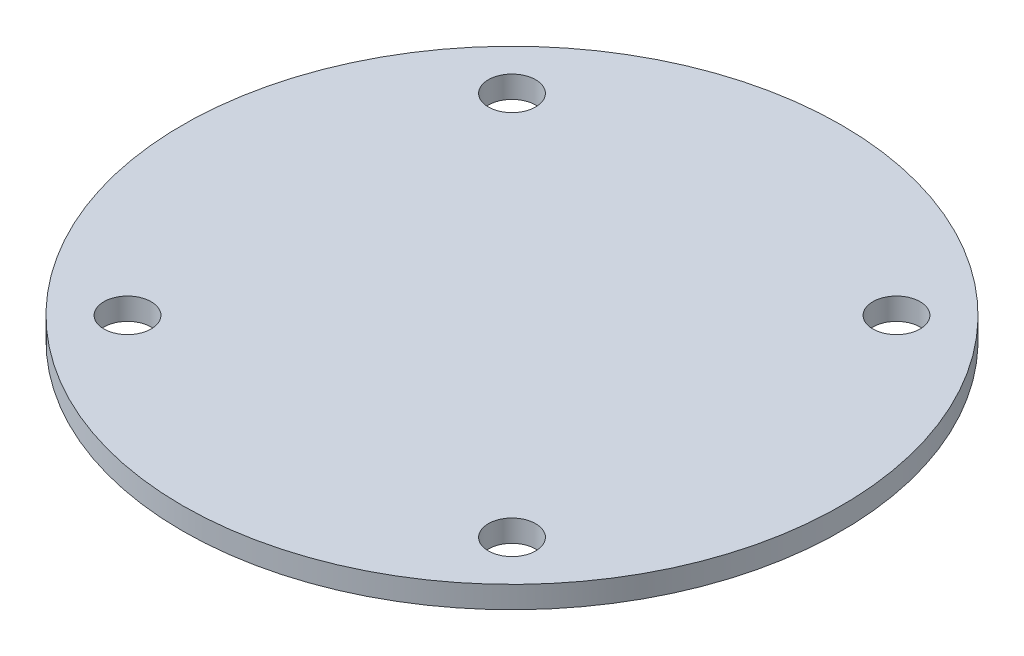
ISO-10303-21;
HEADER;
FILE_DESCRIPTION(('STEP AP214'),'2;1');
FILE_NAME('part.step','',(''),(''),'','','');
FILE_SCHEMA(('AUTOMOTIVE_DESIGN { 1 0 10303 214 1 1 1 1 }'));
ENDSEC;
DATA;
#1=APPLICATION_CONTEXT('core data for automotive mechanical design processes');
#2=APPLICATION_PROTOCOL_DEFINITION('international standard','automotive_design',2000,#1);
#3=PRODUCT_CONTEXT('',#1,'mechanical');
#4=PRODUCT('Part','Part','',(#3));
#5=PRODUCT_RELATED_PRODUCT_CATEGORY('part','',(#4));
#6=PRODUCT_DEFINITION_FORMATION('','',#4);
#7=PRODUCT_DEFINITION_CONTEXT('part definition',#1,'design');
#8=PRODUCT_DEFINITION('design','',#6,#7);
#9=PRODUCT_DEFINITION_SHAPE('','',#8);
#10=(LENGTH_UNIT() NAMED_UNIT(*) SI_UNIT(.MILLI.,.METRE.));
#11=(NAMED_UNIT(*) PLANE_ANGLE_UNIT() SI_UNIT($,.RADIAN.));
#12=(NAMED_UNIT(*) SI_UNIT($,.STERADIAN.) SOLID_ANGLE_UNIT());
#13=UNCERTAINTY_MEASURE_WITH_UNIT(LENGTH_MEASURE(1.E-05),#10,'distance_accuracy_value','');
#14=(GEOMETRIC_REPRESENTATION_CONTEXT(3) GLOBAL_UNCERTAINTY_ASSIGNED_CONTEXT((#13)) GLOBAL_UNIT_ASSIGNED_CONTEXT((#10,
#11,#12)) REPRESENTATION_CONTEXT('',''));
#15=CARTESIAN_POINT('',(0.,0.,0.));
#16=DIRECTION('',(0.,0.,1.));
#17=DIRECTION('',(1.,0.,0.));
#18=AXIS2_PLACEMENT_3D('',#15,#16,#17);
#19=CARTESIAN_POINT('',(0.,-2.,0.));
#20=DIRECTION('',(0.,1.,0.));
#21=DIRECTION('',(0.,0.,1.));
#22=AXIS2_PLACEMENT_3D('',#19,#20,#21);
#23=CYLINDRICAL_SURFACE('',#22,30.);
#24=CARTESIAN_POINT('',(0.,-2.,0.));
#25=DIRECTION('',(0.,1.,0.));
#26=DIRECTION('',(0.,0.,1.));
#27=AXIS2_PLACEMENT_3D('',#24,#25,#26);
#28=CIRCLE('',#27,30.);
#29=CARTESIAN_POINT('',(0.,-2.,30.));
#30=VERTEX_POINT('',#29);
#31=EDGE_CURVE('E10',#30,#30,#28,.T.);
#32=ORIENTED_EDGE('',*,*,#31,.T.);
#33=EDGE_LOOP('',(#32));
#34=FACE_BOUND('',#33,.T.);
#35=CARTESIAN_POINT('',(0.,0.,0.));
#36=DIRECTION('',(0.,1.,0.));
#37=DIRECTION('',(0.,0.,1.));
#38=AXIS2_PLACEMENT_3D('',#35,#36,#37);
#39=CIRCLE('',#38,30.);
#40=CARTESIAN_POINT('',(0.,0.,30.));
#41=VERTEX_POINT('',#40);
#42=EDGE_CURVE('E32',#41,#41,#39,.T.);
#43=ORIENTED_EDGE('',*,*,#42,.F.);
#44=EDGE_LOOP('',(#43));
#45=FACE_BOUND('',#44,.T.);
#46=ADVANCED_FACE('F29',(#34,#45),#23,.T.);
#47=CARTESIAN_POINT('',(0.,-2.,0.));
#48=DIRECTION('',(0.,1.,0.));
#49=DIRECTION('',(0.,0.,1.));
#50=AXIS2_PLACEMENT_3D('',#47,#48,#49);
#51=PLANE('',#50);
#52=CARTESIAN_POINT('',(-17.5,-2.,-17.5));
#53=DIRECTION('',(0.,1.,0.));
#54=DIRECTION('',(0.,0.,1.));
#55=AXIS2_PLACEMENT_3D('',#52,#53,#54);
#56=CIRCLE('',#55,2.15265);
#57=CARTESIAN_POINT('',(-17.5,-2.,-15.34735));
#58=VERTEX_POINT('',#57);
#59=EDGE_CURVE('E58',#58,#58,#56,.T.);
#60=ORIENTED_EDGE('',*,*,#59,.T.);
#61=EDGE_LOOP('',(#60));
#62=FACE_BOUND('',#61,.T.);
#63=CARTESIAN_POINT('',(17.5,-2.,-17.5));
#64=DIRECTION('',(0.,1.,0.));
#65=DIRECTION('',(0.,0.,1.));
#66=AXIS2_PLACEMENT_3D('',#63,#64,#65);
#67=CIRCLE('',#66,2.15265);
#68=CARTESIAN_POINT('',(17.5,-2.,-15.34735));
#69=VERTEX_POINT('',#68);
#70=EDGE_CURVE('E52',#69,#69,#67,.T.);
#71=ORIENTED_EDGE('',*,*,#70,.T.);
#72=EDGE_LOOP('',(#71));
#73=FACE_BOUND('',#72,.T.);
#74=CARTESIAN_POINT('',(17.5,-2.,17.5));
#75=DIRECTION('',(0.,1.,0.));
#76=DIRECTION('',(0.,0.,1.));
#77=AXIS2_PLACEMENT_3D('',#74,#75,#76);
#78=CIRCLE('',#77,2.15265);
#79=CARTESIAN_POINT('',(17.5,-2.,19.65265));
#80=VERTEX_POINT('',#79);
#81=EDGE_CURVE('E46',#80,#80,#78,.T.);
#82=ORIENTED_EDGE('',*,*,#81,.T.);
#83=EDGE_LOOP('',(#82));
#84=FACE_BOUND('',#83,.T.);
#85=CARTESIAN_POINT('',(-17.5,-2.,17.5));
#86=DIRECTION('',(0.,1.,0.));
#87=DIRECTION('',(0.,0.,1.));
#88=AXIS2_PLACEMENT_3D('',#85,#86,#87);
#89=CIRCLE('',#88,2.15265);
#90=CARTESIAN_POINT('',(-17.5,-2.,19.65265));
#91=VERTEX_POINT('',#90);
#92=EDGE_CURVE('E39',#91,#91,#89,.T.);
#93=ORIENTED_EDGE('',*,*,#92,.T.);
#94=EDGE_LOOP('',(#93));
#95=FACE_BOUND('',#94,.T.);
#96=ORIENTED_EDGE('',*,*,#31,.F.);
#97=EDGE_LOOP('',(#96));
#98=FACE_BOUND('',#97,.T.);
#99=ADVANCED_FACE('F71',(#62,#73,#84,#95,#98),#51,.F.);
#100=CARTESIAN_POINT('',(0.,0.,0.));
#101=DIRECTION('',(0.,1.,0.));
#102=DIRECTION('',(0.,0.,1.));
#103=AXIS2_PLACEMENT_3D('',#100,#101,#102);
#104=PLANE('',#103);
#105=CARTESIAN_POINT('',(-17.5,0.,-17.5));
#106=DIRECTION('',(0.,1.,0.));
#107=DIRECTION('',(0.,0.,1.));
#108=AXIS2_PLACEMENT_3D('',#105,#106,#107);
#109=CIRCLE('',#108,2.15265);
#110=CARTESIAN_POINT('',(-17.5,0.,-15.34735));
#111=VERTEX_POINT('',#110);
#112=EDGE_CURVE('E61',#111,#111,#109,.T.);
#113=ORIENTED_EDGE('',*,*,#112,.F.);
#114=EDGE_LOOP('',(#113));
#115=FACE_BOUND('',#114,.T.);
#116=CARTESIAN_POINT('',(17.5,0.,-17.5));
#117=DIRECTION('',(0.,1.,0.));
#118=DIRECTION('',(0.,0.,1.));
#119=AXIS2_PLACEMENT_3D('',#116,#117,#118);
#120=CIRCLE('',#119,2.15265);
#121=CARTESIAN_POINT('',(17.5,0.,-15.34735));
#122=VERTEX_POINT('',#121);
#123=EDGE_CURVE('E55',#122,#122,#120,.T.);
#124=ORIENTED_EDGE('',*,*,#123,.F.);
#125=EDGE_LOOP('',(#124));
#126=FACE_BOUND('',#125,.T.);
#127=CARTESIAN_POINT('',(17.5,0.,17.5));
#128=DIRECTION('',(0.,1.,0.));
#129=DIRECTION('',(0.,0.,1.));
#130=AXIS2_PLACEMENT_3D('',#127,#128,#129);
#131=CIRCLE('',#130,2.15265);
#132=CARTESIAN_POINT('',(17.5,0.,19.65265));
#133=VERTEX_POINT('',#132);
#134=EDGE_CURVE('E49',#133,#133,#131,.T.);
#135=ORIENTED_EDGE('',*,*,#134,.F.);
#136=EDGE_LOOP('',(#135));
#137=FACE_BOUND('',#136,.T.);
#138=CARTESIAN_POINT('',(-17.5,0.,17.5));
#139=DIRECTION('',(0.,1.,0.));
#140=DIRECTION('',(0.,0.,1.));
#141=AXIS2_PLACEMENT_3D('',#138,#139,#140);
#142=CIRCLE('',#141,2.15265);
#143=CARTESIAN_POINT('',(-17.5,0.,19.65265));
#144=VERTEX_POINT('',#143);
#145=EDGE_CURVE('E43',#144,#144,#142,.T.);
#146=ORIENTED_EDGE('',*,*,#145,.F.);
#147=EDGE_LOOP('',(#146));
#148=FACE_BOUND('',#147,.T.);
#149=ORIENTED_EDGE('',*,*,#42,.T.);
#150=EDGE_LOOP('',(#149));
#151=FACE_BOUND('',#150,.T.);
#152=ADVANCED_FACE('F67',(#115,#126,#137,#148,#151),#104,.T.);
#153=CARTESIAN_POINT('',(-17.5,0.,17.5));
#154=DIRECTION('',(0.,1.,0.));
#155=DIRECTION('',(0.,0.,1.));
#156=AXIS2_PLACEMENT_3D('',#153,#154,#155);
#157=CYLINDRICAL_SURFACE('',#156,2.15265);
#158=ORIENTED_EDGE('',*,*,#92,.F.);
#159=EDGE_LOOP('',(#158));
#160=FACE_BOUND('',#159,.T.);
#161=ORIENTED_EDGE('',*,*,#145,.T.);
#162=EDGE_LOOP('',(#161));
#163=FACE_BOUND('',#162,.T.);
#164=ADVANCED_FACE('F70',(#160,#163),#157,.F.);
#165=CARTESIAN_POINT('',(17.5,0.,17.5));
#166=DIRECTION('',(0.,1.,0.));
#167=DIRECTION('',(0.,0.,1.));
#168=AXIS2_PLACEMENT_3D('',#165,#166,#167);
#169=CYLINDRICAL_SURFACE('',#168,2.15265);
#170=ORIENTED_EDGE('',*,*,#81,.F.);
#171=EDGE_LOOP('',(#170));
#172=FACE_BOUND('',#171,.T.);
#173=ORIENTED_EDGE('',*,*,#134,.T.);
#174=EDGE_LOOP('',(#173));
#175=FACE_BOUND('',#174,.T.);
#176=ADVANCED_FACE('F92',(#172,#175),#169,.F.);
#177=CARTESIAN_POINT('',(17.5,0.,-17.5));
#178=DIRECTION('',(0.,1.,0.));
#179=DIRECTION('',(0.,0.,1.));
#180=AXIS2_PLACEMENT_3D('',#177,#178,#179);
#181=CYLINDRICAL_SURFACE('',#180,2.15265);
#182=ORIENTED_EDGE('',*,*,#70,.F.);
#183=EDGE_LOOP('',(#182));
#184=FACE_BOUND('',#183,.T.);
#185=ORIENTED_EDGE('',*,*,#123,.T.);
#186=EDGE_LOOP('',(#185));
#187=FACE_BOUND('',#186,.T.);
#188=ADVANCED_FACE('F96',(#184,#187),#181,.F.);
#189=CARTESIAN_POINT('',(-17.5,0.,-17.5));
#190=DIRECTION('',(0.,1.,0.));
#191=DIRECTION('',(0.,0.,1.));
#192=AXIS2_PLACEMENT_3D('',#189,#190,#191);
#193=CYLINDRICAL_SURFACE('',#192,2.15265);
#194=ORIENTED_EDGE('',*,*,#59,.F.);
#195=EDGE_LOOP('',(#194));
#196=FACE_BOUND('',#195,.T.);
#197=ORIENTED_EDGE('',*,*,#112,.T.);
#198=EDGE_LOOP('',(#197));
#199=FACE_BOUND('',#198,.T.);
#200=ADVANCED_FACE('F65',(#196,#199),#193,.F.);
#201=CLOSED_SHELL('',(#46,#99,#152,#164,#176,#188,#200));
#202=MANIFOLD_SOLID_BREP('B2',#201);
#203=ADVANCED_BREP_SHAPE_REPRESENTATION('',(#18,#202),#14);
#204=SHAPE_DEFINITION_REPRESENTATION(#9,#203);
ENDSEC;
END-ISO-10303-21;
